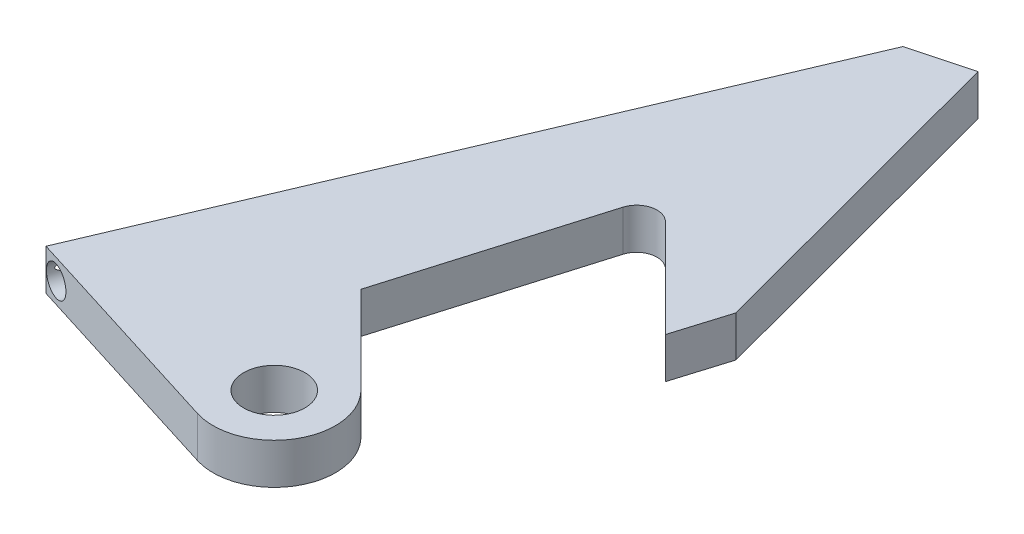
ISO-10303-21;
HEADER;
FILE_DESCRIPTION(('STEP AP214'),'2;1');
FILE_NAME('part.step','',(''),(''),'','','');
FILE_SCHEMA(('AUTOMOTIVE_DESIGN { 1 0 10303 214 1 1 1 1 }'));
ENDSEC;
DATA;
#1=APPLICATION_CONTEXT('core data for automotive mechanical design processes');
#2=APPLICATION_PROTOCOL_DEFINITION('international standard','automotive_design',2000,#1);
#3=PRODUCT_CONTEXT('',#1,'mechanical');
#4=PRODUCT('Part','Part','',(#3));
#5=PRODUCT_RELATED_PRODUCT_CATEGORY('part','',(#4));
#6=PRODUCT_DEFINITION_FORMATION('','',#4);
#7=PRODUCT_DEFINITION_CONTEXT('part definition',#1,'design');
#8=PRODUCT_DEFINITION('design','',#6,#7);
#9=PRODUCT_DEFINITION_SHAPE('','',#8);
#10=(LENGTH_UNIT() NAMED_UNIT(*) SI_UNIT(.MILLI.,.METRE.));
#11=(NAMED_UNIT(*) PLANE_ANGLE_UNIT() SI_UNIT($,.RADIAN.));
#12=(NAMED_UNIT(*) SI_UNIT($,.STERADIAN.) SOLID_ANGLE_UNIT());
#13=UNCERTAINTY_MEASURE_WITH_UNIT(LENGTH_MEASURE(1.E-05),#10,'distance_accuracy_value','');
#14=(GEOMETRIC_REPRESENTATION_CONTEXT(3) GLOBAL_UNCERTAINTY_ASSIGNED_CONTEXT((#13)) GLOBAL_UNIT_ASSIGNED_CONTEXT((#10,
#11,#12)) REPRESENTATION_CONTEXT('',''));
#15=CARTESIAN_POINT('',(0.,0.,0.));
#16=DIRECTION('',(0.,0.,1.));
#17=DIRECTION('',(1.,0.,0.));
#18=AXIS2_PLACEMENT_3D('',#15,#16,#17);
#19=CARTESIAN_POINT('',(-9.58336148505084,6.35,57.0523987186824));
#20=DIRECTION('',(0.,1.,0.));
#21=DIRECTION('',(0.,0.,1.));
#22=AXIS2_PLACEMENT_3D('',#19,#20,#21);
#23=PLANE('',#22);
#24=DIRECTION('',(0.292719197910584,0.,-0.956198447590553));
#25=VECTOR('',#24,1.);
#26=CARTESIAN_POINT('',(13.3155738088918,6.35,19.1289332993239));
#27=LINE('',#26,#25);
#28=CARTESIAN_POINT('',(13.3155738088918,6.35,19.1289332993239));
#29=VERTEX_POINT('',#28);
#30=CARTESIAN_POINT('',(15.8794716912915,6.35,10.7536876972908));
#31=VERTEX_POINT('',#30);
#32=EDGE_CURVE('E176',#29,#31,#27,.T.);
#33=ORIENTED_EDGE('',*,*,#32,.T.);
#34=DIRECTION('',(-0.25723629660689,0.,-0.96634853324666));
#35=VECTOR('',#34,1.);
#36=CARTESIAN_POINT('',(15.8794716912915,6.35,10.7536876972908));
#37=LINE('',#36,#35);
#38=CARTESIAN_POINT('',(2.2197595002291,6.35,-40.5611656671901));
#39=VERTEX_POINT('',#38);
#40=EDGE_CURVE('E107',#31,#39,#37,.T.);
#41=ORIENTED_EDGE('',*,*,#40,.T.);
#42=DIRECTION('',(-0.96634853324666,0.,0.257236296606892));
#43=VECTOR('',#42,1.);
#44=CARTESIAN_POINT('',(-6.99422582657964,6.35,-38.1084569591886));
#45=LINE('',#44,#43);
#46=CARTESIAN_POINT('',(-6.99422582657964,6.35,-38.1084569591886));
#47=VERTEX_POINT('',#46);
#48=EDGE_CURVE('E268',#39,#47,#45,.T.);
#49=ORIENTED_EDGE('',*,*,#48,.T.);
#50=DIRECTION('',(-0.391080688495198,0.,0.920356395689258));
#51=VECTOR('',#50,1.);
#52=CARTESIAN_POINT('',(-46.7280237776918,6.35,55.39975284284));
#53=LINE('',#52,#51);
#54=CARTESIAN_POINT('',(-46.7280237776918,6.35,55.39975284284));
#55=VERTEX_POINT('',#54);
#56=EDGE_CURVE('E266',#47,#55,#53,.T.);
#57=ORIENTED_EDGE('',*,*,#56,.T.);
#58=DIRECTION('',(0.954289276042193,0.,0.298884555691437));
#59=VECTOR('',#58,1.);
#60=CARTESIAN_POINT('',(-12.3815604695126,6.35,66.1571067010044));
#61=LINE('',#60,#59);
#62=CARTESIAN_POINT('',(-12.3815604695126,6.35,66.1571067010044));
#63=VERTEX_POINT('',#62);
#64=EDGE_CURVE('E262',#55,#63,#61,.T.);
#65=ORIENTED_EDGE('',*,*,#64,.T.);
#66=CARTESIAN_POINT('',(-9.58336148505084,6.35,57.0523987186824));
#67=DIRECTION('',(0.,1.,0.));
#68=DIRECTION('',(0.,0.,1.));
#69=AXIS2_PLACEMENT_3D('',#66,#67,#68);
#70=CIRCLE('',#69,9.525);
#71=CARTESIAN_POINT('',(-2.71547260344062,6.35,50.4525708944241));
#72=VERTEX_POINT('',#71);
#73=EDGE_CURVE('E258',#63,#72,#70,.T.);
#74=ORIENTED_EDGE('',*,*,#73,.T.);
#75=DIRECTION('',(-0.707038114572614,0.,-0.707175441132964));
#76=VECTOR('',#75,1.);
#77=CARTESIAN_POINT('',(-2.71547260344062,6.35,50.4525708944241));
#78=LINE('',#77,#76);
#79=CARTESIAN_POINT('',(-16.4492107059134,6.35,36.7161653162162));
#80=VERTEX_POINT('',#79);
#81=EDGE_CURVE('E135',#72,#80,#78,.T.);
#82=ORIENTED_EDGE('',*,*,#81,.T.);
#83=DIRECTION('',(0.284015344703923,0.,-0.958819734868193));
#84=VECTOR('',#83,1.);
#85=CARTESIAN_POINT('',(-7.14392939853329,6.35,5.30206209120496));
#86=LINE('',#85,#84);
#87=CARTESIAN_POINT('',(-7.14392939853329,6.35,5.30206209120496));
#88=VERTEX_POINT('',#87);
#89=EDGE_CURVE('E128',#80,#88,#86,.T.);
#90=ORIENTED_EDGE('',*,*,#89,.T.);
#91=CARTESIAN_POINT('',(-4.09967674032677,6.35,6.20381081063987));
#92=DIRECTION('',(0.,-1.,0.));
#93=DIRECTION('',(0.,0.,1.));
#94=AXIS2_PLACEMENT_3D('',#91,#92,#93);
#95=CIRCLE('',#94,3.175);
#96=CARTESIAN_POINT('',(-1.85461271005945,6.35,3.95874678037261));
#97=VERTEX_POINT('',#96);
#98=EDGE_CURVE('E132',#88,#97,#95,.T.);
#99=ORIENTED_EDGE('',*,*,#98,.T.);
#100=DIRECTION('',(0.707106781186547,0.,0.707106781186548));
#101=VECTOR('',#100,1.);
#102=CARTESIAN_POINT('',(13.3155738088918,6.35,19.1289332993239));
#103=LINE('',#102,#101);
#104=EDGE_CURVE('E59',#97,#29,#103,.T.);
#105=ORIENTED_EDGE('',*,*,#104,.T.);
#106=EDGE_LOOP('',(#33,#41,#49,#57,#65,#74,#82,#90,#99,#105));
#107=FACE_BOUND('',#106,.T.);
#108=CARTESIAN_POINT('',(-9.58336148505084,6.35,57.0523987186824));
#109=DIRECTION('',(0.,1.,0.));
#110=DIRECTION('',(0.,0.,1.));
#111=AXIS2_PLACEMENT_3D('',#108,#109,#110);
#112=CIRCLE('',#111,4.7625);
#113=CARTESIAN_POINT('',(-9.58336148505084,6.35,61.8148987186824));
#114=VERTEX_POINT('',#113);
#115=EDGE_CURVE('E160',#114,#114,#112,.T.);
#116=ORIENTED_EDGE('',*,*,#115,.F.);
#117=EDGE_LOOP('',(#116));
#118=FACE_BOUND('',#117,.T.);
#119=ADVANCED_FACE('F36',(#107,#118),#23,.T.);
#120=CARTESIAN_POINT('',(-9.58336148505084,0.,57.0523987186824));
#121=DIRECTION('',(0.,1.,0.));
#122=DIRECTION('',(0.,0.,1.));
#123=AXIS2_PLACEMENT_3D('',#120,#121,#122);
#124=PLANE('',#123);
#125=DIRECTION('',(0.292719197910584,0.,-0.956198447590553));
#126=VECTOR('',#125,1.);
#127=CARTESIAN_POINT('',(13.3155738088918,0.,19.1289332993239));
#128=LINE('',#127,#126);
#129=CARTESIAN_POINT('',(13.3155738088918,0.,19.1289332993239));
#130=VERTEX_POINT('',#129);
#131=CARTESIAN_POINT('',(15.8794716912915,0.,10.7536876972908));
#132=VERTEX_POINT('',#131);
#133=EDGE_CURVE('E156',#130,#132,#128,.T.);
#134=ORIENTED_EDGE('',*,*,#133,.F.);
#135=DIRECTION('',(0.707106781186547,0.,0.707106781186548));
#136=VECTOR('',#135,1.);
#137=CARTESIAN_POINT('',(13.3155738088918,0.,19.1289332993239));
#138=LINE('',#137,#136);
#139=CARTESIAN_POINT('',(-1.85461271005945,0.,3.95874678037261));
#140=VERTEX_POINT('',#139);
#141=EDGE_CURVE('E98',#140,#130,#138,.T.);
#142=ORIENTED_EDGE('',*,*,#141,.F.);
#143=CARTESIAN_POINT('',(-4.09967674032677,0.,6.20381081063987));
#144=DIRECTION('',(0.,-1.,0.));
#145=DIRECTION('',(0.,0.,1.));
#146=AXIS2_PLACEMENT_3D('',#143,#144,#145);
#147=CIRCLE('',#146,3.175);
#148=CARTESIAN_POINT('',(-7.14392939853329,0.,5.30206209120496));
#149=VERTEX_POINT('',#148);
#150=EDGE_CURVE('E173',#149,#140,#147,.T.);
#151=ORIENTED_EDGE('',*,*,#150,.F.);
#152=DIRECTION('',(0.284015344703923,0.,-0.958819734868193));
#153=VECTOR('',#152,1.);
#154=CARTESIAN_POINT('',(-7.14392939853329,0.,5.30206209120496));
#155=LINE('',#154,#153);
#156=CARTESIAN_POINT('',(-16.4492107059134,0.,36.7161653162162));
#157=VERTEX_POINT('',#156);
#158=EDGE_CURVE('E144',#157,#149,#155,.T.);
#159=ORIENTED_EDGE('',*,*,#158,.F.);
#160=DIRECTION('',(-0.707038114572614,0.,-0.707175441132964));
#161=VECTOR('',#160,1.);
#162=CARTESIAN_POINT('',(-2.71547260344062,0.,50.4525708944241));
#163=LINE('',#162,#161);
#164=CARTESIAN_POINT('',(-2.71547260344062,0.,50.4525708944241));
#165=VERTEX_POINT('',#164);
#166=EDGE_CURVE('E170',#165,#157,#163,.T.);
#167=ORIENTED_EDGE('',*,*,#166,.F.);
#168=CARTESIAN_POINT('',(-9.58336148505084,0.,57.0523987186824));
#169=DIRECTION('',(0.,1.,0.));
#170=DIRECTION('',(0.,0.,1.));
#171=AXIS2_PLACEMENT_3D('',#168,#169,#170);
#172=CIRCLE('',#171,9.525);
#173=CARTESIAN_POINT('',(-12.3815604695126,0.,66.1571067010044));
#174=VERTEX_POINT('',#173);
#175=EDGE_CURVE('E168',#174,#165,#172,.T.);
#176=ORIENTED_EDGE('',*,*,#175,.F.);
#177=DIRECTION('',(0.954289276042193,0.,0.298884555691437));
#178=VECTOR('',#177,1.);
#179=CARTESIAN_POINT('',(-12.3815604695126,0.,66.1571067010044));
#180=LINE('',#179,#178);
#181=CARTESIAN_POINT('',(-46.7280237776918,0.,55.39975284284));
#182=VERTEX_POINT('',#181);
#183=EDGE_CURVE('E166',#182,#174,#180,.T.);
#184=ORIENTED_EDGE('',*,*,#183,.F.);
#185=DIRECTION('',(-0.391080688495198,0.,0.920356395689258));
#186=VECTOR('',#185,1.);
#187=CARTESIAN_POINT('',(-46.7280237776918,0.,55.39975284284));
#188=LINE('',#187,#186);
#189=CARTESIAN_POINT('',(-6.99422582657964,0.,-38.1084569591886));
#190=VERTEX_POINT('',#189);
#191=EDGE_CURVE('E164',#190,#182,#188,.T.);
#192=ORIENTED_EDGE('',*,*,#191,.F.);
#193=DIRECTION('',(-0.96634853324666,0.,0.257236296606892));
#194=VECTOR('',#193,1.);
#195=CARTESIAN_POINT('',(-6.99422582657964,0.,-38.1084569591886));
#196=LINE('',#195,#194);
#197=CARTESIAN_POINT('',(2.2197595002291,0.,-40.5611656671901));
#198=VERTEX_POINT('',#197);
#199=EDGE_CURVE('E162',#198,#190,#196,.T.);
#200=ORIENTED_EDGE('',*,*,#199,.F.);
#201=DIRECTION('',(-0.25723629660689,0.,-0.96634853324666));
#202=VECTOR('',#201,1.);
#203=CARTESIAN_POINT('',(15.8794716912915,0.,10.7536876972908));
#204=LINE('',#203,#202);
#205=EDGE_CURVE('E159',#132,#198,#204,.T.);
#206=ORIENTED_EDGE('',*,*,#205,.F.);
#207=EDGE_LOOP('',(#134,#142,#151,#159,#167,#176,#184,#192,#200,#206));
#208=FACE_BOUND('',#207,.T.);
#209=CARTESIAN_POINT('',(-9.58336148505084,0.,57.0523987186824));
#210=DIRECTION('',(0.,1.,0.));
#211=DIRECTION('',(0.,0.,1.));
#212=AXIS2_PLACEMENT_3D('',#209,#210,#211);
#213=CIRCLE('',#212,4.7625);
#214=CARTESIAN_POINT('',(-9.58336148505084,0.,61.8148987186824));
#215=VERTEX_POINT('',#214);
#216=EDGE_CURVE('E272',#215,#215,#213,.T.);
#217=ORIENTED_EDGE('',*,*,#216,.T.);
#218=EDGE_LOOP('',(#217));
#219=FACE_BOUND('',#218,.T.);
#220=ADVANCED_FACE('F221',(#208,#219),#124,.F.);
#221=CARTESIAN_POINT('',(13.3155738088918,6.35,19.1289332993239));
#222=DIRECTION('',(-0.956198447590553,0.,-0.292719197910584));
#223=DIRECTION('',(-0.292719197910584,0.,0.956198447590554));
#224=AXIS2_PLACEMENT_3D('',#221,#222,#223);
#225=PLANE('',#224);
#226=ORIENTED_EDGE('',*,*,#133,.T.);
#227=DIRECTION('',(0.,-1.,0.));
#228=VECTOR('',#227,1.);
#229=CARTESIAN_POINT('',(15.8794716912915,6.35,10.7536876972908));
#230=LINE('',#229,#228);
#231=EDGE_CURVE('E195',#31,#132,#230,.T.);
#232=ORIENTED_EDGE('',*,*,#231,.F.);
#233=ORIENTED_EDGE('',*,*,#32,.F.);
#234=DIRECTION('',(0.,-1.,0.));
#235=VECTOR('',#234,1.);
#236=CARTESIAN_POINT('',(13.3155738088918,6.35,19.1289332993239));
#237=LINE('',#236,#235);
#238=EDGE_CURVE('E152',#29,#130,#237,.T.);
#239=ORIENTED_EDGE('',*,*,#238,.T.);
#240=EDGE_LOOP('',(#226,#232,#233,#239));
#241=FACE_BOUND('',#240,.T.);
#242=ADVANCED_FACE('F38',(#241),#225,.F.);
#243=CARTESIAN_POINT('',(15.8794716912915,6.35,10.7536876972908));
#244=DIRECTION('',(-0.966348533246661,0.,0.25723629660689));
#245=DIRECTION('',(0.25723629660689,0.,0.966348533246661));
#246=AXIS2_PLACEMENT_3D('',#243,#244,#245);
#247=PLANE('',#246);
#248=ORIENTED_EDGE('',*,*,#205,.T.);
#249=DIRECTION('',(0.,-1.,0.));
#250=VECTOR('',#249,1.);
#251=CARTESIAN_POINT('',(2.2197595002291,6.35,-40.5611656671901));
#252=LINE('',#251,#250);
#253=EDGE_CURVE('E192',#39,#198,#252,.T.);
#254=ORIENTED_EDGE('',*,*,#253,.F.);
#255=ORIENTED_EDGE('',*,*,#40,.F.);
#256=ORIENTED_EDGE('',*,*,#231,.T.);
#257=EDGE_LOOP('',(#248,#254,#255,#256));
#258=FACE_BOUND('',#257,.T.);
#259=ADVANCED_FACE('F288',(#258),#247,.F.);
#260=CARTESIAN_POINT('',(-6.99422582657964,6.35,-38.1084569591886));
#261=DIRECTION('',(0.257236296606892,0.,0.96634853324666));
#262=DIRECTION('',(0.96634853324666,0.,-0.257236296606892));
#263=AXIS2_PLACEMENT_3D('',#260,#261,#262);
#264=PLANE('',#263);
#265=ORIENTED_EDGE('',*,*,#199,.T.);
#266=DIRECTION('',(0.,-1.,0.));
#267=VECTOR('',#266,1.);
#268=CARTESIAN_POINT('',(-6.99422582657964,6.35,-38.1084569591886));
#269=LINE('',#268,#267);
#270=EDGE_CURVE('E189',#47,#190,#269,.T.);
#271=ORIENTED_EDGE('',*,*,#270,.F.);
#272=ORIENTED_EDGE('',*,*,#48,.F.);
#273=ORIENTED_EDGE('',*,*,#253,.T.);
#274=EDGE_LOOP('',(#265,#271,#272,#273));
#275=FACE_BOUND('',#274,.T.);
#276=ADVANCED_FACE('F244',(#275),#264,.F.);
#277=CARTESIAN_POINT('',(-46.7280237776918,6.35,55.39975284284));
#278=DIRECTION('',(0.920356395689258,0.,0.391080688495198));
#279=DIRECTION('',(0.391080688495198,0.,-0.920356395689258));
#280=AXIS2_PLACEMENT_3D('',#277,#278,#279);
#281=PLANE('',#280);
#282=CARTESIAN_POINT('',(-45.8721012157896,1.26243727746105,53.3854529113029));
#283=CARTESIAN_POINT('',(-45.862183595635,1.32357903831347,53.362113111083));
#284=CARTESIAN_POINT('',(-45.852477298209,1.38494479520589,53.3392706308039));
#285=CARTESIAN_POINT('',(-45.8335709495984,1.50820365089398,53.2947770534558));
#286=CARTESIAN_POINT('',(-45.8243710451174,1.57009689656994,53.2731263016342));
#287=CARTESIAN_POINT('',(-45.7975837868378,1.75719995752433,53.2100860513588));
#288=CARTESIAN_POINT('',(-45.7809007973859,1.8832774840897,53.1708248541355));
#289=CARTESIAN_POINT('',(-45.7510912978183,2.13651339911661,53.100672160877));
#290=CARTESIAN_POINT('',(-45.7379234629076,2.26363928019762,53.069683412432));
#291=CARTESIAN_POINT('',(-45.7160802476384,2.52025276137046,53.0182783099382));
#292=CARTESIAN_POINT('',(-45.7073969435237,2.64973577449299,52.9978433083828));
#293=CARTESIAN_POINT('',(-45.6961608237317,2.89846685088497,52.9714005945965));
#294=CARTESIAN_POINT('',(-45.6931192427595,3.01756579157533,52.9642426382381));
#295=CARTESIAN_POINT('',(-45.6920575156656,3.25594126659156,52.961744004708));
#296=CARTESIAN_POINT('',(-45.6940382988503,3.37521782970239,52.9664055145348));
#297=CARTESIAN_POINT('',(-45.7027564975742,3.61274837175125,52.9869226359127));
#298=CARTESIAN_POINT('',(-45.7095005953964,3.73100067761061,53.0027939733282));
#299=CARTESIAN_POINT('',(-45.7269669709765,3.96554939816097,53.0438987656322));
#300=CARTESIAN_POINT('',(-45.7376905772052,4.08184514613092,53.0691353468998));
#301=CARTESIAN_POINT('',(-45.758048605147,4.27317459893957,53.117045258514));
#302=CARTESIAN_POINT('',(-45.7668194644252,4.34882870738309,53.1376863095039));
#303=CARTESIAN_POINT('',(-45.7854661445039,4.49921386476484,53.1815687914922));
#304=CARTESIAN_POINT('',(-45.795341618109,4.57394519559002,53.2048094054122));
#305=CARTESIAN_POINT('',(-45.8159500722902,4.72224386004654,53.2533086618799));
#306=CARTESIAN_POINT('',(-45.8266789910328,4.79581491995101,53.2785577454426));
#307=CARTESIAN_POINT('',(-45.8488752164499,4.94221824840616,53.3307936103773));
#308=CARTESIAN_POINT('',(-45.860342446591,5.01505059262902,53.3577802116382));
#309=CARTESIAN_POINT('',(-45.8721012157896,5.08756272253895,53.3854529113029));
#310=B_SPLINE_CURVE_WITH_KNOTS('',3,(#282,#283,#284,#285,#286,#287,#288,#289,#290,#291,#292,
#293,#294,#295,#296,#297,#298,#299,#300,#301,#302,#303,#304,#305,#306,#307,#308,#309),
.UNSPECIFIED.,.F.,.F.,(4,2,2,2,2,2,2,2,2,2,2,2,2,4),(0.,0.198571502738011,0.39720023271054,
0.796265894413545,1.19040984553106,1.58385497695954,1.94125443811656,2.29872003501484,
2.6566881061678,3.01477578468323,3.25144692410535,3.48804388245838,3.72357538608479,
3.9590825137036),.UNSPECIFIED.);
#311=CARTESIAN_POINT('',(-45.729861915734,2.35896245277688,53.0507116331581));
#312=VERTEX_POINT('',#311);
#313=CARTESIAN_POINT('',(-45.7298619157339,3.99103754722333,53.050711633158));
#314=VERTEX_POINT('',#313);
#315=EDGE_CURVE('E44',#312,#314,#310,.T.);
#316=ORIENTED_EDGE('',*,*,#315,.T.);
#317=CARTESIAN_POINT('',(-37.1108080526579,3.175,32.7669145011767));
#318=DIRECTION('',(0.920356395689258,0.,0.391080688495198));
#319=DIRECTION('',(-0.391080688495198,0.,0.920356395689258));
#320=AXIS2_PLACEMENT_3D('',#317,#318,#319);
#321=ELLIPSE('',#320,23.5559581362407,2.3114);
#322=EDGE_CURVE('E11',#314,#312,#321,.T.);
#323=ORIENTED_EDGE('',*,*,#322,.T.);
#324=EDGE_LOOP('',(#316,#323));
#325=FACE_BOUND('',#324,.T.);
#326=ORIENTED_EDGE('',*,*,#191,.T.);
#327=DIRECTION('',(0.,-1.,0.));
#328=VECTOR('',#327,1.);
#329=CARTESIAN_POINT('',(-46.7280237776918,6.35,55.39975284284));
#330=LINE('',#329,#328);
#331=EDGE_CURVE('E186',#55,#182,#330,.T.);
#332=ORIENTED_EDGE('',*,*,#331,.F.);
#333=ORIENTED_EDGE('',*,*,#56,.F.);
#334=ORIENTED_EDGE('',*,*,#270,.T.);
#335=EDGE_LOOP('',(#326,#332,#333,#334));
#336=FACE_BOUND('',#335,.T.);
#337=ADVANCED_FACE('F203',(#325,#336),#281,.F.);
#338=CARTESIAN_POINT('',(-12.3815604695126,6.35,66.1571067010044));
#339=DIRECTION('',(0.298884555691437,0.,-0.954289276042193));
#340=DIRECTION('',(-0.954289276042193,0.,-0.298884555691437));
#341=AXIS2_PLACEMENT_3D('',#338,#339,#340);
#342=PLANE('',#341);
#343=CARTESIAN_POINT('',(-44.425323754602,3.175,56.1209612757234));
#344=DIRECTION('',(-0.298884555691437,0.,0.954289276042193));
#345=DIRECTION('',(0.954289276042193,0.,0.298884555691437));
#346=AXIS2_PLACEMENT_3D('',#343,#344,#345);
#347=CIRCLE('',#346,2.3114);
#348=CARTESIAN_POINT('',(-42.219579521958,3.175,56.8118030377486));
#349=VERTEX_POINT('',#348);
#350=EDGE_CURVE('E249',#349,#349,#347,.T.);
#351=ORIENTED_EDGE('',*,*,#350,.F.);
#352=EDGE_LOOP('',(#351));
#353=FACE_BOUND('',#352,.T.);
#354=ORIENTED_EDGE('',*,*,#183,.T.);
#355=DIRECTION('',(0.,-1.,0.));
#356=VECTOR('',#355,1.);
#357=CARTESIAN_POINT('',(-12.3815604695126,6.35,66.1571067010044));
#358=LINE('',#357,#356);
#359=EDGE_CURVE('E183',#63,#174,#358,.T.);
#360=ORIENTED_EDGE('',*,*,#359,.F.);
#361=ORIENTED_EDGE('',*,*,#64,.F.);
#362=ORIENTED_EDGE('',*,*,#331,.T.);
#363=EDGE_LOOP('',(#354,#360,#361,#362));
#364=FACE_BOUND('',#363,.T.);
#365=ADVANCED_FACE('F237',(#353,#364),#342,.F.);
#366=CARTESIAN_POINT('',(-9.58336148505084,6.35,57.0523987186824));
#367=DIRECTION('',(0.,-1.,0.));
#368=DIRECTION('',(0.,0.,-1.));
#369=AXIS2_PLACEMENT_3D('',#366,#367,#368);
#370=CYLINDRICAL_SURFACE('',#369,9.525);
#371=ORIENTED_EDGE('',*,*,#175,.T.);
#372=DIRECTION('',(0.,-1.,0.));
#373=VECTOR('',#372,1.);
#374=CARTESIAN_POINT('',(-2.71547260344062,6.35,50.4525708944241));
#375=LINE('',#374,#373);
#376=EDGE_CURVE('E180',#72,#165,#375,.T.);
#377=ORIENTED_EDGE('',*,*,#376,.F.);
#378=ORIENTED_EDGE('',*,*,#73,.F.);
#379=ORIENTED_EDGE('',*,*,#359,.T.);
#380=EDGE_LOOP('',(#371,#377,#378,#379));
#381=FACE_BOUND('',#380,.T.);
#382=ADVANCED_FACE('F234',(#381),#370,.T.);
#383=CARTESIAN_POINT('',(-2.71547260344062,6.35,50.4525708944241));
#384=DIRECTION('',(-0.707175441132964,0.,0.707038114572614));
#385=DIRECTION('',(0.707038114572614,0.,0.707175441132964));
#386=AXIS2_PLACEMENT_3D('',#383,#384,#385);
#387=PLANE('',#386);
#388=ORIENTED_EDGE('',*,*,#166,.T.);
#389=DIRECTION('',(0.,-1.,0.));
#390=VECTOR('',#389,1.);
#391=CARTESIAN_POINT('',(-16.4492107059134,6.35,36.7161653162162));
#392=LINE('',#391,#390);
#393=EDGE_CURVE('E147',#80,#157,#392,.T.);
#394=ORIENTED_EDGE('',*,*,#393,.F.);
#395=ORIENTED_EDGE('',*,*,#81,.F.);
#396=ORIENTED_EDGE('',*,*,#376,.T.);
#397=EDGE_LOOP('',(#388,#394,#395,#396));
#398=FACE_BOUND('',#397,.T.);
#399=ADVANCED_FACE('F231',(#398),#387,.F.);
#400=CARTESIAN_POINT('',(-7.14392939853329,6.35,5.30206209120496));
#401=DIRECTION('',(-0.958819734868193,0.,-0.284015344703923));
#402=DIRECTION('',(-0.284015344703923,0.,0.958819734868193));
#403=AXIS2_PLACEMENT_3D('',#400,#401,#402);
#404=PLANE('',#403);
#405=ORIENTED_EDGE('',*,*,#158,.T.);
#406=DIRECTION('',(0.,-1.,0.));
#407=VECTOR('',#406,1.);
#408=CARTESIAN_POINT('',(-7.14392939853329,6.35,5.30206209120496));
#409=LINE('',#408,#407);
#410=EDGE_CURVE('E141',#88,#149,#409,.T.);
#411=ORIENTED_EDGE('',*,*,#410,.F.);
#412=ORIENTED_EDGE('',*,*,#89,.F.);
#413=ORIENTED_EDGE('',*,*,#393,.T.);
#414=EDGE_LOOP('',(#405,#411,#412,#413));
#415=FACE_BOUND('',#414,.T.);
#416=ADVANCED_FACE('F142',(#415),#404,.F.);
#417=CARTESIAN_POINT('',(-4.09967674032677,6.35,6.20381081063987));
#418=DIRECTION('',(0.,-1.,0.));
#419=DIRECTION('',(0.,0.,-1.));
#420=AXIS2_PLACEMENT_3D('',#417,#418,#419);
#421=CYLINDRICAL_SURFACE('',#420,3.175);
#422=ORIENTED_EDGE('',*,*,#150,.T.);
#423=DIRECTION('',(0.,-1.,0.));
#424=VECTOR('',#423,1.);
#425=CARTESIAN_POINT('',(-1.85461271005945,6.35,3.95874678037261));
#426=LINE('',#425,#424);
#427=EDGE_CURVE('E148',#97,#140,#426,.T.);
#428=ORIENTED_EDGE('',*,*,#427,.F.);
#429=ORIENTED_EDGE('',*,*,#98,.F.);
#430=ORIENTED_EDGE('',*,*,#410,.T.);
#431=EDGE_LOOP('',(#422,#428,#429,#430));
#432=FACE_BOUND('',#431,.T.);
#433=ADVANCED_FACE('F150',(#432),#421,.F.);
#434=CARTESIAN_POINT('',(13.3155738088918,6.35,19.1289332993239));
#435=DIRECTION('',(0.707106781186548,0.,-0.707106781186547));
#436=DIRECTION('',(-0.707106781186547,0.,-0.707106781186548));
#437=AXIS2_PLACEMENT_3D('',#434,#435,#436);
#438=PLANE('',#437);
#439=ORIENTED_EDGE('',*,*,#141,.T.);
#440=ORIENTED_EDGE('',*,*,#238,.F.);
#441=ORIENTED_EDGE('',*,*,#104,.F.);
#442=ORIENTED_EDGE('',*,*,#427,.T.);
#443=EDGE_LOOP('',(#439,#440,#441,#442));
#444=FACE_BOUND('',#443,.T.);
#445=ADVANCED_FACE('F217',(#444),#438,.F.);
#446=CARTESIAN_POINT('',(-9.58336148505084,6.35,57.0523987186824));
#447=DIRECTION('',(0.,-1.,0.));
#448=DIRECTION('',(0.,0.,-1.));
#449=AXIS2_PLACEMENT_3D('',#446,#447,#448);
#450=CYLINDRICAL_SURFACE('',#449,4.7625);
#451=ORIENTED_EDGE('',*,*,#115,.T.);
#452=EDGE_LOOP('',(#451));
#453=FACE_BOUND('',#452,.T.);
#454=ORIENTED_EDGE('',*,*,#216,.F.);
#455=EDGE_LOOP('',(#454));
#456=FACE_BOUND('',#455,.T.);
#457=ADVANCED_FACE('F214',(#453,#456),#450,.F.);
#458=CARTESIAN_POINT('',(-44.425323754602,3.175,56.1209612757234));
#459=DIRECTION('',(-0.298884555691437,0.,0.954289276042193));
#460=DIRECTION('',(0.954289276042193,0.,0.298884555691437));
#461=AXIS2_PLACEMENT_3D('',#458,#459,#460);
#462=CYLINDRICAL_SURFACE('',#461,2.3114);
#463=ORIENTED_EDGE('',*,*,#350,.T.);
#464=EDGE_LOOP('',(#463));
#465=FACE_BOUND('',#464,.T.);
#466=CARTESIAN_POINT('',(-43.6661569831457,3.175,53.6970665145763));
#467=DIRECTION('',(-0.298884555691437,0.,0.954289276042193));
#468=DIRECTION('',(0.954289276042193,0.,0.298884555691437));
#469=AXIS2_PLACEMENT_3D('',#466,#467,#468);
#470=CIRCLE('',#469,2.3114);
#471=EDGE_CURVE('E50',#312,#314,#470,.T.);
#472=ORIENTED_EDGE('',*,*,#471,.F.);
#473=ORIENTED_EDGE('',*,*,#322,.F.);
#474=EDGE_LOOP('',(#472,#473));
#475=FACE_BOUND('',#474,.T.);
#476=ADVANCED_FACE('F212',(#465,#475),#462,.F.);
#477=CARTESIAN_POINT('',(-43.6661569831457,3.175,53.6970665145763));
#478=DIRECTION('',(-0.298884555691437,0.,0.954289276042193));
#479=DIRECTION('',(0.954289276042193,0.,0.298884555691437));
#480=AXIS2_PLACEMENT_3D('',#477,#478,#479);
#481=CONICAL_SURFACE('',#480,2.3114,1.02974425867665);
#482=CARTESIAN_POINT('',(-43.2510573743652,3.175,52.3717216695334));
#483=VERTEX_POINT('',#482);
#484=VERTEX_LOOP('',#483);
#485=FACE_BOUND('',#484,.T.);
#486=ORIENTED_EDGE('',*,*,#471,.T.);
#487=ORIENTED_EDGE('',*,*,#315,.F.);
#488=EDGE_LOOP('',(#486,#487));
#489=FACE_BOUND('',#488,.T.);
#490=ADVANCED_FACE('F207',(#485,#489),#481,.F.);
#491=CLOSED_SHELL('',(#119,#220,#242,#259,#276,#337,#365,#382,#399,#416,#433,#445,#457,#476,#490));
#492=MANIFOLD_SOLID_BREP('B2',#491);
#493=ADVANCED_BREP_SHAPE_REPRESENTATION('',(#18,#492),#14);
#494=SHAPE_DEFINITION_REPRESENTATION(#9,#493);
ENDSEC;
END-ISO-10303-21;
